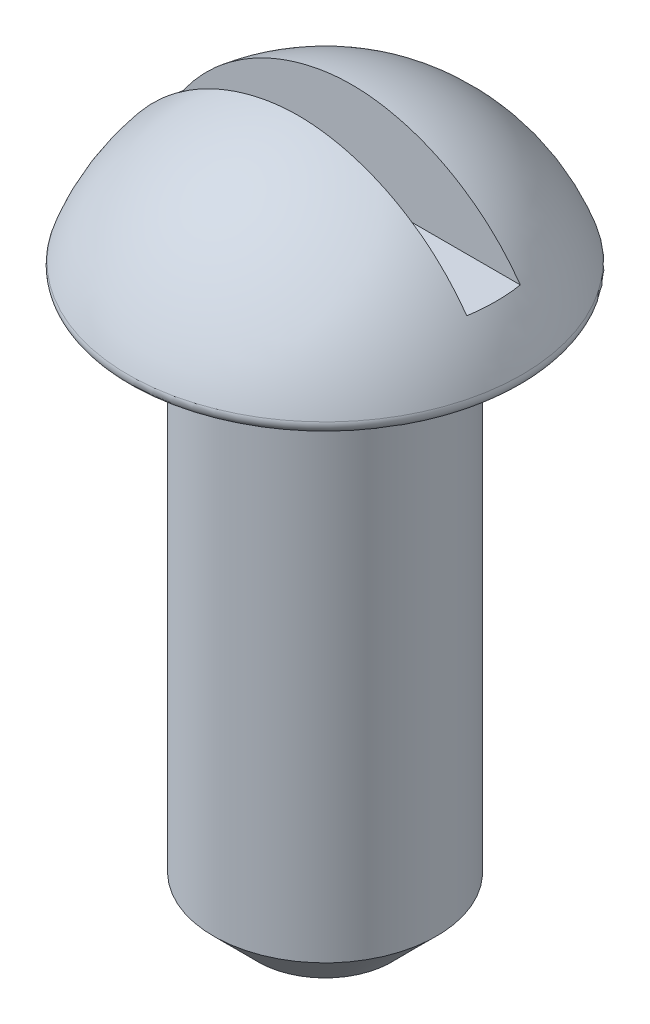
ISO-10303-21;
HEADER;
FILE_DESCRIPTION(('STEP AP214'),'2;1');
FILE_NAME('part.step','',(''),(''),'','','');
FILE_SCHEMA(('AUTOMOTIVE_DESIGN { 1 0 10303 214 1 1 1 1 }'));
ENDSEC;
DATA;
#1=APPLICATION_CONTEXT('core data for automotive mechanical design processes');
#2=APPLICATION_PROTOCOL_DEFINITION('international standard','automotive_design',2000,#1);
#3=PRODUCT_CONTEXT('',#1,'mechanical');
#4=PRODUCT('Part','Part','',(#3));
#5=PRODUCT_RELATED_PRODUCT_CATEGORY('part','',(#4));
#6=PRODUCT_DEFINITION_FORMATION('','',#4);
#7=PRODUCT_DEFINITION_CONTEXT('part definition',#1,'design');
#8=PRODUCT_DEFINITION('design','',#6,#7);
#9=PRODUCT_DEFINITION_SHAPE('','',#8);
#10=(LENGTH_UNIT() NAMED_UNIT(*) SI_UNIT(.MILLI.,.METRE.));
#11=(NAMED_UNIT(*) PLANE_ANGLE_UNIT() SI_UNIT($,.RADIAN.));
#12=(NAMED_UNIT(*) SI_UNIT($,.STERADIAN.) SOLID_ANGLE_UNIT());
#13=UNCERTAINTY_MEASURE_WITH_UNIT(LENGTH_MEASURE(1.E-05),#10,'distance_accuracy_value','');
#14=(GEOMETRIC_REPRESENTATION_CONTEXT(3) GLOBAL_UNCERTAINTY_ASSIGNED_CONTEXT((#13)) GLOBAL_UNIT_ASSIGNED_CONTEXT((#10,
#11,#12)) REPRESENTATION_CONTEXT('',''));
#15=CARTESIAN_POINT('',(0.,0.,0.));
#16=DIRECTION('',(0.,0.,1.));
#17=DIRECTION('',(1.,0.,0.));
#18=AXIS2_PLACEMENT_3D('',#15,#16,#17);
#19=CARTESIAN_POINT('',(0.,89.8612136985376,0.));
#20=DIRECTION('',(0.,1.,0.));
#21=DIRECTION('',(-1.,0.,0.));
#22=AXIS2_PLACEMENT_3D('',#19,#20,#21);
#23=DEGENERATE_TOROIDAL_SURFACE('',#22,0.0534658929339495,2.40000000000001,.F.);
#24=CARTESIAN_POINT('',(0.,90.6686869412309,0.));
#25=DIRECTION('',(0.,-1.,0.));
#26=DIRECTION('',(1.,0.,0.));
#27=AXIS2_PLACEMENT_3D('',#24,#25,#26);
#28=CIRCLE('',#27,2.2066197165805);
#29=CARTESIAN_POINT('',(2.20661971658049,90.6686869412309,0.));
#30=VERTEX_POINT('',#29);
#31=EDGE_CURVE('E109',#30,#30,#28,.F.);
#32=ORIENTED_EDGE('',*,*,#31,.T.);
#33=EDGE_LOOP('',(#32));
#34=FACE_BOUND('',#33,.T.);
#35=CARTESIAN_POINT('',(0.,91.2350422227854,0.));
#36=DIRECTION('',(0.,1.,0.));
#37=DIRECTION('',(0.,0.,1.));
#38=AXIS2_PLACEMENT_3D('',#35,#36,#37);
#39=CIRCLE('',#38,1.91442515739459);
#40=CARTESIAN_POINT('',(1.89077330298089,91.2350422227854,0.3));
#41=VERTEX_POINT('',#40);
#42=CARTESIAN_POINT('',(1.89077330298089,91.2350422227854,-0.3));
#43=VERTEX_POINT('',#42);
#44=EDGE_CURVE('E59',#41,#43,#39,.T.);
#45=ORIENTED_EDGE('',*,*,#44,.F.);
#46=CARTESIAN_POINT('',(0.,92.2350422227854,0.3));
#47=CARTESIAN_POINT('',(-0.100848371690478,92.2350321878107,0.3));
#48=CARTESIAN_POINT('',(-0.201787447572002,92.2273576353458,0.3));
#49=CARTESIAN_POINT('',(-0.366459678367074,92.2035970820281,0.3));
#50=CARTESIAN_POINT('',(-0.430818892932461,92.191407955457,0.3));
#51=CARTESIAN_POINT('',(-0.558288837781709,92.1616587540551,0.3));
#52=CARTESIAN_POINT('',(-0.621399518165776,92.1440984650165,0.3));
#53=CARTESIAN_POINT('',(-0.808395820047688,92.0835444087679,0.3));
#54=CARTESIAN_POINT('',(-0.929831459988878,92.0326943870407,0.3));
#55=CARTESIAN_POINT('',(-1.16286074404738,91.9115362427297,0.3));
#56=CARTESIAN_POINT('',(-1.2744302254421,91.8411820040172,0.3));
#57=CARTESIAN_POINT('',(-1.48438047813139,91.6830512231431,0.3));
#58=CARTESIAN_POINT('',(-1.58276790203237,91.5952835249616,0.3));
#59=CARTESIAN_POINT('',(-1.76524540556903,91.4031097155245,0.3));
#60=CARTESIAN_POINT('',(-1.84906628044512,91.2984478865949,0.3));
#61=CARTESIAN_POINT('',(-1.9979883999925,91.0765338786182,0.3));
#62=CARTESIAN_POINT('',(-2.06308615799744,90.9592793601049,0.3));
#63=CARTESIAN_POINT('',(-2.17276843305649,90.7153682203999,0.3));
#64=CARTESIAN_POINT('',(-2.2173281122971,90.5887004289744,0.3));
#65=CARTESIAN_POINT('',(-2.28455380115353,90.3296880701066,0.3));
#66=CARTESIAN_POINT('',(-2.30722064208471,90.1973437184142,0.3));
#67=CARTESIAN_POINT('',(-2.3300246951293,89.9306900416885,0.3));
#68=CARTESIAN_POINT('',(-2.3301555232407,89.7963801706387,0.3));
#69=CARTESIAN_POINT('',(-2.3078677425782,89.5296433557768,0.3));
#70=CARTESIAN_POINT('',(-2.28544891099428,89.3972164305828,0.3));
#71=CARTESIAN_POINT('',(-2.21869562967325,89.1380016243118,0.3));
#72=CARTESIAN_POINT('',(-2.17436049131951,89.0112139205572,0.3));
#73=CARTESIAN_POINT('',(-2.06503231586471,88.7668814215965,0.3));
#74=CARTESIAN_POINT('',(-2.00003904915328,88.6493367291425,0.3));
#75=CARTESIAN_POINT('',(-1.85123525857421,88.4268350228379,0.3));
#76=CARTESIAN_POINT('',(-1.76742577756094,88.3218773118712,0.3));
#77=CARTESIAN_POINT('',(-1.5833965896332,88.1275486341886,0.3));
#78=CARTESIAN_POINT('',(-1.48317880476966,88.038175844401,0.3));
#79=CARTESIAN_POINT('',(-1.269158249537,87.8775787766974,0.3));
#80=CARTESIAN_POINT('',(-1.15536571875353,87.8063409449171,0.3));
#81=CARTESIAN_POINT('',(-0.977002657044613,87.7146278224101,0.3));
#82=CARTESIAN_POINT('',(-0.916218809754055,87.6865647432198,0.3));
#83=CARTESIAN_POINT('',(-0.792472065458213,87.6356763106977,0.3));
#84=CARTESIAN_POINT('',(-0.72950901360219,87.6128513304597,0.3));
#85=CARTESIAN_POINT('',(-0.601937479136454,87.5726728476787,0.3));
#86=CARTESIAN_POINT('',(-0.537330829104396,87.5553135171512,0.3));
#87=CARTESIAN_POINT('',(-0.406860992449473,87.5262284679164,0.3));
#88=CARTESIAN_POINT('',(-0.340997816473399,87.5145027014968,0.3));
#89=CARTESIAN_POINT('',(-0.208558661916344,87.4970282791506,0.3));
#90=CARTESIAN_POINT('',(-0.141983907705257,87.4912706384504,0.3));
#91=CARTESIAN_POINT('',(-0.041961445965514,87.4875490231141,0.3));
#92=CARTESIAN_POINT('',(-0.00859382098820436,87.4871276306527,0.3));
#93=CARTESIAN_POINT('',(0.0581210045866453,87.4879470211567,0.3));
#94=CARTESIAN_POINT('',(0.0914682051569627,87.4891878063327,0.3));
#95=CARTESIAN_POINT('',(0.186091197136806,87.4949858136209,0.3));
#96=CARTESIAN_POINT('',(0.247256979176967,87.5014551037281,0.3));
#97=CARTESIAN_POINT('',(0.368853441314723,87.5193713042799,0.3));
#98=CARTESIAN_POINT('',(0.429283924629704,87.5308195183342,0.3));
#99=CARTESIAN_POINT('',(0.549138291638741,87.5584884648092,0.3));
#100=CARTESIAN_POINT('',(0.608560603371025,87.5747160344736,0.3));
#101=CARTESIAN_POINT('',(0.725927181812833,87.6117671583596,0.3));
#102=CARTESIAN_POINT('',(0.783871658060108,87.6325900569367,0.3));
#103=CARTESIAN_POINT('',(0.959863617336263,87.7037208768452,0.3));
#104=CARTESIAN_POINT('',(1.0749863041386,87.7615252508314,0.3));
#105=CARTESIAN_POINT('',(1.29425126544972,87.8948734015023,0.3));
#106=CARTESIAN_POINT('',(1.39840105204625,87.9704049262644,0.3));
#107=CARTESIAN_POINT('',(1.59712916487466,88.1406473208625,0.3));
#108=CARTESIAN_POINT('',(1.69115203854631,88.2360088664802,0.3));
#109=CARTESIAN_POINT('',(1.86192648735281,88.4411654553935,0.3));
#110=CARTESIAN_POINT('',(1.93867103105441,88.5509663461046,0.3));
#111=CARTESIAN_POINT('',(2.07283272731725,88.7821210680642,0.3));
#112=CARTESIAN_POINT('',(2.1302080275479,88.9034991988361,0.3));
#113=CARTESIAN_POINT('',(2.2237691589597,89.1541485495781,0.3));
#114=CARTESIAN_POINT('',(2.25995724895863,89.2834189265142,0.3));
#115=CARTESIAN_POINT('',(2.31014138373252,89.5462603949189,0.3));
#116=CARTESIAN_POINT('',(2.32412712673563,89.6798334534993,0.3));
#117=CARTESIAN_POINT('',(2.32947745007233,89.9474337727752,0.3));
#118=CARTESIAN_POINT('',(2.32084168562224,90.0814610403624,0.3));
#119=CARTESIAN_POINT('',(2.28119215869912,90.3461706289947,0.3));
#120=CARTESIAN_POINT('',(2.2501772644219,90.4768527805174,0.3));
#121=CARTESIAN_POINT('',(2.1666449134228,90.7311634815896,0.3));
#122=CARTESIAN_POINT('',(2.11412604949465,90.8547915689222,0.3));
#123=CARTESIAN_POINT('',(1.98907046576465,91.0914810324233,0.3));
#124=CARTESIAN_POINT('',(1.91653253186928,91.2045417671582,0.3));
#125=CARTESIAN_POINT('',(1.75352322640109,91.4168415102063,0.3));
#126=CARTESIAN_POINT('',(1.66305724562227,91.5160846581015,0.3));
#127=CARTESIAN_POINT('',(1.4668047815236,91.6979007564883,0.3));
#128=CARTESIAN_POINT('',(1.36102937097234,91.7804856528429,0.3));
#129=CARTESIAN_POINT('',(1.1369978233755,91.926787348426,0.3));
#130=CARTESIAN_POINT('',(1.0187276147854,91.9904825603059,0.3));
#131=CARTESIAN_POINT('',(0.773055411948245,92.0970299827131,0.3));
#132=CARTESIAN_POINT('',(0.645653742642193,92.1398829344854,0.3));
#133=CARTESIAN_POINT('',(0.450793572249422,92.1872833677843,0.3));
#134=CARTESIAN_POINT('',(0.3852801562954,92.2002658474191,0.3));
#135=CARTESIAN_POINT('',(0.253372674964092,92.2203827524599,0.3));
#136=CARTESIAN_POINT('',(0.186979361428496,92.2275218798816,0.3));
#137=CARTESIAN_POINT('',(0.0803237562217226,92.2338342250275,0.3));
#138=CARTESIAN_POINT('',(0.0401690733163809,92.2350462198318,0.3));
#139=CARTESIAN_POINT('',(0.,92.2350422227854,0.3));
#140=B_SPLINE_CURVE_WITH_KNOTS('',3,(#46,#47,#48,#49,#50,#51,#52,#53,#54,#55,#56,#57,#58,#59,
#60,#61,#62,#63,#64,#65,#66,#67,#68,#69,#70,#71,#72,#73,#74,#75,#76,#77,#78,#79,#80,#81,#82,#83,
#84,#85,#86,#87,#88,#89,#90,#91,#92,#93,#94,#95,#96,#97,#98,#99,#100,#101,#102,#103,#104,#105,
#106,#107,#108,#109,#110,#111,#112,#113,#114,#115,#116,#117,#118,#119,#120,#121,#122,#123,#124,
#125,#126,#127,#128,#129,#130,#131,#132,#133,#134,#135,#136,#137,#138,#139),.UNSPECIFIED.,.T.,
.F.,(4,2,2,2,2,2,2,2,2,2,2,2,2,2,2,2,2,2,2,2,2,2,2,2,2,2,2,2,2,2,2,2,2,2,2,2,2,2,2,2,2,2,2,2,2,
2,4),(0.,0.302452667134651,0.498767609042046,0.695090381223869,1.08807804874249,
1.48200294694679,1.8757282876338,2.27609594927553,2.67653812019709,3.0774633050529,
3.47837326536961,3.87939679527856,4.28042428768362,4.68146438128814,5.08250893251738,
5.48353126206834,5.8845066498626,6.28518146743669,6.48583235677549,6.68649753343195,
6.8869480118366,7.08739679253884,7.28754336543045,7.38761714650624,7.48769106067651,
7.67197015897022,7.85629753532254,8.04088989803356,8.22545594079593,8.61005903655504,
8.99439709689559,9.39423625987201,9.79423784484911,10.1950982873469,10.5959159853943,
10.9969196064379,11.3979293393777,11.7989593544424,12.2000156168546,12.6010962074124,
13.0020563793227,13.4027279868299,13.8038557374099,14.2049692210282,14.4051327517884,
14.6051350566104,14.7256054534767),.UNSPECIFIED.);
#141=CARTESIAN_POINT('',(-1.89077330298091,91.2350422227854,0.3));
#142=VERTEX_POINT('',#141);
#143=EDGE_CURVE('E57',#41,#142,#140,.T.);
#144=ORIENTED_EDGE('',*,*,#143,.T.);
#145=CARTESIAN_POINT('',(-1.89077330298091,91.2350422227854,-0.3));
#146=VERTEX_POINT('',#145);
#147=EDGE_CURVE('E58',#146,#142,#39,.T.);
#148=ORIENTED_EDGE('',*,*,#147,.F.);
#149=CARTESIAN_POINT('',(0.,92.2350422227854,-0.3));
#150=CARTESIAN_POINT('',(0.100848371690464,92.2350321878107,-0.3));
#151=CARTESIAN_POINT('',(0.201787447571988,92.2273576353458,-0.3));
#152=CARTESIAN_POINT('',(0.366459678367059,92.2035970820281,-0.3));
#153=CARTESIAN_POINT('',(0.430818892932444,92.191407955457,-0.3));
#154=CARTESIAN_POINT('',(0.558288837781693,92.1616587540551,-0.3));
#155=CARTESIAN_POINT('',(0.621399518165761,92.1440984650165,-0.3));
#156=CARTESIAN_POINT('',(0.808395820047674,92.0835444087679,-0.3));
#157=CARTESIAN_POINT('',(0.929831459988864,92.0326943870407,-0.3));
#158=CARTESIAN_POINT('',(1.16286074404737,91.9115362427297,-0.3));
#159=CARTESIAN_POINT('',(1.27443022544209,91.8411820040172,-0.3));
#160=CARTESIAN_POINT('',(1.48438047813137,91.6830512231431,-0.3));
#161=CARTESIAN_POINT('',(1.58276790203236,91.5952835249616,-0.3));
#162=CARTESIAN_POINT('',(1.76524540556902,91.4031097155245,-0.3));
#163=CARTESIAN_POINT('',(1.84906628044511,91.2984478865949,-0.3));
#164=CARTESIAN_POINT('',(1.99798839999249,91.0765338786182,-0.3));
#165=CARTESIAN_POINT('',(2.06308615799742,90.9592793601049,-0.3));
#166=CARTESIAN_POINT('',(2.17276843305647,90.7153682203999,-0.3));
#167=CARTESIAN_POINT('',(2.21732811229709,90.5887004289744,-0.3));
#168=CARTESIAN_POINT('',(2.28455380115352,90.3296880701067,-0.3));
#169=CARTESIAN_POINT('',(2.3072206420847,90.1973437184142,-0.3));
#170=CARTESIAN_POINT('',(2.33002469512929,89.9306900416885,-0.3));
#171=CARTESIAN_POINT('',(2.33015552324069,89.7963801706387,-0.3));
#172=CARTESIAN_POINT('',(2.30786774257819,89.5296433557768,-0.3));
#173=CARTESIAN_POINT('',(2.28544891099427,89.3972164305828,-0.3));
#174=CARTESIAN_POINT('',(2.21869562967324,89.1380016243118,-0.3));
#175=CARTESIAN_POINT('',(2.1743604913195,89.0112139205572,-0.3));
#176=CARTESIAN_POINT('',(2.0650323158647,88.7668814215965,-0.3));
#177=CARTESIAN_POINT('',(2.00003904915327,88.6493367291425,-0.3));
#178=CARTESIAN_POINT('',(1.8512352585742,88.4268350228379,-0.3));
#179=CARTESIAN_POINT('',(1.76742577756093,88.3218773118712,-0.3));
#180=CARTESIAN_POINT('',(1.58339658963319,88.1275486341886,-0.3));
#181=CARTESIAN_POINT('',(1.48317880476966,88.038175844401,-0.3));
#182=CARTESIAN_POINT('',(1.269158249537,87.8775787766974,-0.3));
#183=CARTESIAN_POINT('',(1.15536571875353,87.8063409449171,-0.3));
#184=CARTESIAN_POINT('',(0.977002657044607,87.7146278224101,-0.3));
#185=CARTESIAN_POINT('',(0.916218809754048,87.6865647432198,-0.3));
#186=CARTESIAN_POINT('',(0.792472065458204,87.6356763106977,-0.3));
#187=CARTESIAN_POINT('',(0.729509013602181,87.6128513304597,-0.3));
#188=CARTESIAN_POINT('',(0.601937479136444,87.5726728476787,-0.3));
#189=CARTESIAN_POINT('',(0.537330829104385,87.5553135171512,-0.3));
#190=CARTESIAN_POINT('',(0.406860992449463,87.5262284679165,-0.3));
#191=CARTESIAN_POINT('',(0.340997816473388,87.5145027014968,-0.3));
#192=CARTESIAN_POINT('',(0.208558661916332,87.4970282791506,-0.3));
#193=CARTESIAN_POINT('',(0.141983907705244,87.4912706384504,-0.3));
#194=CARTESIAN_POINT('',(0.0419614459655008,87.4875490231141,-0.3));
#195=CARTESIAN_POINT('',(0.00859382098819143,87.4871276306527,-0.3));
#196=CARTESIAN_POINT('',(-0.0581210045866578,87.4879470211567,-0.3));
#197=CARTESIAN_POINT('',(-0.0914682051569749,87.4891878063327,-0.3));
#198=CARTESIAN_POINT('',(-0.186091197136818,87.4949858136209,-0.3));
#199=CARTESIAN_POINT('',(-0.24725697917698,87.5014551037281,-0.3));
#200=CARTESIAN_POINT('',(-0.368853441314735,87.5193713042799,-0.3));
#201=CARTESIAN_POINT('',(-0.429283924629716,87.5308195183342,-0.3));
#202=CARTESIAN_POINT('',(-0.549138291638752,87.5584884648092,-0.3));
#203=CARTESIAN_POINT('',(-0.608560603371035,87.5747160344736,-0.3));
#204=CARTESIAN_POINT('',(-0.725927181812843,87.6117671583596,-0.3));
#205=CARTESIAN_POINT('',(-0.783871658060119,87.6325900569367,-0.3));
#206=CARTESIAN_POINT('',(-0.959863617336276,87.7037208768452,-0.3));
#207=CARTESIAN_POINT('',(-1.07498630413861,87.7615252508314,-0.3));
#208=CARTESIAN_POINT('',(-1.29425126544973,87.8948734015023,-0.3));
#209=CARTESIAN_POINT('',(-1.39840105204626,87.9704049262644,-0.3));
#210=CARTESIAN_POINT('',(-1.59712916487467,88.1406473208625,-0.3));
#211=CARTESIAN_POINT('',(-1.69115203854633,88.2360088664802,-0.3));
#212=CARTESIAN_POINT('',(-1.86192648735282,88.4411654553935,-0.3));
#213=CARTESIAN_POINT('',(-1.93867103105443,88.5509663461046,-0.3));
#214=CARTESIAN_POINT('',(-2.07283272731727,88.7821210680642,-0.3));
#215=CARTESIAN_POINT('',(-2.13020802754792,88.9034991988361,-0.3));
#216=CARTESIAN_POINT('',(-2.22376915895971,89.1541485495781,-0.3));
#217=CARTESIAN_POINT('',(-2.25995724895864,89.2834189265142,-0.3));
#218=CARTESIAN_POINT('',(-2.31014138373253,89.5462603949189,-0.3));
#219=CARTESIAN_POINT('',(-2.32412712673564,89.6798334534993,-0.3));
#220=CARTESIAN_POINT('',(-2.32947745007235,89.9474337727752,-0.3));
#221=CARTESIAN_POINT('',(-2.32084168562226,90.0814610403624,-0.3));
#222=CARTESIAN_POINT('',(-2.28119215869913,90.3461706289947,-0.3));
#223=CARTESIAN_POINT('',(-2.25017726442192,90.4768527805174,-0.3));
#224=CARTESIAN_POINT('',(-2.16664491342281,90.7311634815896,-0.3));
#225=CARTESIAN_POINT('',(-2.11412604949466,90.8547915689222,-0.3));
#226=CARTESIAN_POINT('',(-1.98907046576466,91.0914810324233,-0.3));
#227=CARTESIAN_POINT('',(-1.9165325318693,91.2045417671582,-0.3));
#228=CARTESIAN_POINT('',(-1.75352322640111,91.4168415102063,-0.3));
#229=CARTESIAN_POINT('',(-1.66305724562229,91.5160846581015,-0.3));
#230=CARTESIAN_POINT('',(-1.46680478152361,91.6979007564883,-0.3));
#231=CARTESIAN_POINT('',(-1.36102937097236,91.7804856528429,-0.3));
#232=CARTESIAN_POINT('',(-1.13699782337551,91.926787348426,-0.3));
#233=CARTESIAN_POINT('',(-1.01872761478541,91.9904825603059,-0.3));
#234=CARTESIAN_POINT('',(-0.773055411948259,92.0970299827131,-0.3));
#235=CARTESIAN_POINT('',(-0.645653742642207,92.1398829344854,-0.3));
#236=CARTESIAN_POINT('',(-0.450793572249437,92.1872833677843,-0.3));
#237=CARTESIAN_POINT('',(-0.385280156295417,92.2002658474191,-0.3));
#238=CARTESIAN_POINT('',(-0.253372674964109,92.2203827524599,-0.3));
#239=CARTESIAN_POINT('',(-0.186979361428512,92.2275218798816,-0.3));
#240=CARTESIAN_POINT('',(-0.0803237562217377,92.2338342250275,-0.3));
#241=CARTESIAN_POINT('',(-0.0401690733163955,92.2350462198318,-0.3));
#242=CARTESIAN_POINT('',(0.,92.2350422227854,-0.3));
#243=B_SPLINE_CURVE_WITH_KNOTS('',3,(#149,#150,#151,#152,#153,#154,#155,#156,#157,#158,#159,
#160,#161,#162,#163,#164,#165,#166,#167,#168,#169,#170,#171,#172,#173,#174,#175,#176,#177,#178,
#179,#180,#181,#182,#183,#184,#185,#186,#187,#188,#189,#190,#191,#192,#193,#194,#195,#196,#197,
#198,#199,#200,#201,#202,#203,#204,#205,#206,#207,#208,#209,#210,#211,#212,#213,#214,#215,#216,
#217,#218,#219,#220,#221,#222,#223,#224,#225,#226,#227,#228,#229,#230,#231,#232,#233,#234,#235,
#236,#237,#238,#239,#240,#241,#242),.UNSPECIFIED.,.T.,.F.,(4,2,2,2,2,2,2,2,2,2,2,2,2,2,2,2,2,2,
2,2,2,2,2,2,2,2,2,2,2,2,2,2,2,2,2,2,2,2,2,2,2,2,2,2,2,2,4),(0.,0.302452667134651,
0.498767609042043,0.695090381223869,1.08807804874249,1.48200294694679,1.8757282876338,
2.27609594927553,2.67653812019709,3.07746330505289,3.47837326536961,3.87939679527854,
4.28042428768361,4.68146438128814,5.08250893251738,5.48353126206834,5.88450664986258,
6.28518146743669,6.48583235677548,6.68649753343195,6.88694801183659,7.08739679253884,
7.28754336543045,7.38761714650625,7.48769106067651,7.67197015897022,7.85629753532254,
8.04088989803356,8.22545594079593,8.61005903655504,8.99439709689559,9.39423625987201,
9.79423784484911,10.1950982873469,10.5959159853943,10.9969196064379,11.3979293393777,
11.7989593544424,12.2000156168546,12.6010962074124,13.0020563793227,13.4027279868299,
13.8038557374099,14.2049692210282,14.4051327517884,14.6051350566104,14.7256054534767),.UNSPECIFIED.);
#244=EDGE_CURVE('E51',#146,#43,#243,.T.);
#245=ORIENTED_EDGE('',*,*,#244,.T.);
#246=EDGE_LOOP('',(#45,#144,#148,#245));
#247=FACE_BOUND('',#246,.T.);
#248=ADVANCED_FACE('F29',(#34,#247),#23,.F.);
#249=CARTESIAN_POINT('',(1.25000000000002,90.5350422227853,0.));
#250=DIRECTION('',(0.,1.,0.));
#251=DIRECTION('',(-1.,0.,0.));
#252=AXIS2_PLACEMENT_3D('',#249,#250,#251);
#253=PLANE('',#252);
#254=CARTESIAN_POINT('',(0.,90.5350422227853,0.));
#255=DIRECTION('',(0.,1.,0.));
#256=DIRECTION('',(-1.,0.,0.));
#257=AXIS2_PLACEMENT_3D('',#254,#255,#256);
#258=CIRCLE('',#257,2.11244948285073);
#259=CARTESIAN_POINT('',(-2.11244948285074,90.5350422227853,0.));
#260=VERTEX_POINT('',#259);
#261=EDGE_CURVE('E104',#260,#260,#258,.F.);
#262=ORIENTED_EDGE('',*,*,#261,.T.);
#263=EDGE_LOOP('',(#262));
#264=FACE_BOUND('',#263,.T.);
#265=CARTESIAN_POINT('',(0.,90.5350422227853,0.));
#266=DIRECTION('',(0.,1.,0.));
#267=DIRECTION('',(-1.,0.,0.));
#268=AXIS2_PLACEMENT_3D('',#265,#266,#267);
#269=CIRCLE('',#268,1.25000000000002);
#270=CARTESIAN_POINT('',(-1.25000000000003,90.5350422227853,0.));
#271=VERTEX_POINT('',#270);
#272=EDGE_CURVE('E66',#271,#271,#269,.T.);
#273=ORIENTED_EDGE('',*,*,#272,.T.);
#274=EDGE_LOOP('',(#273));
#275=FACE_BOUND('',#274,.T.);
#276=ADVANCED_FACE('F92',(#264,#275),#253,.F.);
#277=CARTESIAN_POINT('',(0.,125.763182897862,0.));
#278=DIRECTION('',(0.,1.,0.));
#279=DIRECTION('',(-1.,0.,0.));
#280=AXIS2_PLACEMENT_3D('',#277,#278,#279);
#281=CYLINDRICAL_SURFACE('',#280,1.25000000000002);
#282=CARTESIAN_POINT('',(0.,84.7356460627854,0.));
#283=DIRECTION('',(0.,1.,0.));
#284=DIRECTION('',(-1.,0.,0.));
#285=AXIS2_PLACEMENT_3D('',#282,#283,#284);
#286=CIRCLE('',#285,1.25000000000002);
#287=CARTESIAN_POINT('',(-1.25000000000003,84.7356460627854,0.));
#288=VERTEX_POINT('',#287);
#289=EDGE_CURVE('E37',#288,#288,#286,.T.);
#290=ORIENTED_EDGE('',*,*,#289,.T.);
#291=EDGE_LOOP('',(#290));
#292=FACE_BOUND('',#291,.T.);
#293=ORIENTED_EDGE('',*,*,#272,.F.);
#294=EDGE_LOOP('',(#293));
#295=FACE_BOUND('',#294,.T.);
#296=ADVANCED_FACE('F89',(#292,#295),#281,.T.);
#297=CARTESIAN_POINT('',(1.25000000000002,84.2356460627854,0.));
#298=DIRECTION('',(0.,1.,0.));
#299=DIRECTION('',(-1.,0.,0.));
#300=AXIS2_PLACEMENT_3D('',#297,#298,#299);
#301=PLANE('',#300);
#302=CARTESIAN_POINT('',(0.,84.2356460627854,0.));
#303=DIRECTION('',(0.,1.,0.));
#304=DIRECTION('',(-1.,0.,0.));
#305=AXIS2_PLACEMENT_3D('',#302,#303,#304);
#306=CIRCLE('',#305,0.75000000000002);
#307=CARTESIAN_POINT('',(-0.750000000000026,84.2356460627854,0.));
#308=VERTEX_POINT('',#307);
#309=EDGE_CURVE('E11',#308,#308,#306,.F.);
#310=ORIENTED_EDGE('',*,*,#309,.T.);
#311=EDGE_LOOP('',(#310));
#312=FACE_BOUND('',#311,.T.);
#313=ADVANCED_FACE('F86',(#312),#301,.F.);
#314=CARTESIAN_POINT('',(-2.25000000000001,91.2350422227854,0.3));
#315=DIRECTION('',(0.,1.,0.));
#316=DIRECTION('',(0.,0.,1.));
#317=AXIS2_PLACEMENT_3D('',#314,#315,#316);
#318=PLANE('',#317);
#319=ORIENTED_EDGE('',*,*,#44,.T.);
#320=DIRECTION('',(-1.,0.,0.));
#321=VECTOR('',#320,1.);
#322=CARTESIAN_POINT('',(-2.25000000000001,91.2350422227854,-0.3));
#323=LINE('',#322,#321);
#324=EDGE_CURVE('E44',#43,#146,#323,.T.);
#325=ORIENTED_EDGE('',*,*,#324,.T.);
#326=ORIENTED_EDGE('',*,*,#147,.T.);
#327=DIRECTION('',(1.,0.,0.));
#328=VECTOR('',#327,1.);
#329=CARTESIAN_POINT('',(-2.25000000000001,91.2350422227854,0.3));
#330=LINE('',#329,#328);
#331=EDGE_CURVE('E65',#142,#41,#330,.T.);
#332=ORIENTED_EDGE('',*,*,#331,.T.);
#333=EDGE_LOOP('',(#319,#325,#326,#332));
#334=FACE_BOUND('',#333,.T.);
#335=ADVANCED_FACE('F64',(#334),#318,.T.);
#336=CARTESIAN_POINT('',(-2.25000000000001,91.2350422227854,-0.3));
#337=DIRECTION('',(0.,0.,-1.));
#338=DIRECTION('',(-1.,0.,0.));
#339=AXIS2_PLACEMENT_3D('',#336,#337,#338);
#340=PLANE('',#339);
#341=ORIENTED_EDGE('',*,*,#244,.F.);
#342=ORIENTED_EDGE('',*,*,#324,.F.);
#343=EDGE_LOOP('',(#341,#342));
#344=FACE_BOUND('',#343,.T.);
#345=ADVANCED_FACE('F83',(#344),#340,.F.);
#346=CARTESIAN_POINT('',(-2.25000000000001,91.2350422227854,0.3));
#347=DIRECTION('',(0.,0.,1.));
#348=DIRECTION('',(1.,0.,0.));
#349=AXIS2_PLACEMENT_3D('',#346,#347,#348);
#350=PLANE('',#349);
#351=ORIENTED_EDGE('',*,*,#143,.F.);
#352=ORIENTED_EDGE('',*,*,#331,.F.);
#353=EDGE_LOOP('',(#351,#352));
#354=FACE_BOUND('',#353,.T.);
#355=ADVANCED_FACE('F68',(#354),#350,.F.);
#356=CARTESIAN_POINT('',(0.,90.6350422227854,0.));
#357=DIRECTION('',(0.,1.,0.));
#358=DIRECTION('',(-1.,0.,0.));
#359=AXIS2_PLACEMENT_3D('',#356,#357,#358);
#360=TOROIDAL_SURFACE('',#359,2.11244948285073,0.1);
#361=ORIENTED_EDGE('',*,*,#261,.F.);
#362=EDGE_LOOP('',(#361));
#363=FACE_BOUND('',#362,.T.);
#364=ORIENTED_EDGE('',*,*,#31,.F.);
#365=EDGE_LOOP('',(#364));
#366=FACE_BOUND('',#365,.T.);
#367=ADVANCED_FACE('F82',(#363,#366),#360,.T.);
#368=CARTESIAN_POINT('',(0.,84.7356460627854,0.));
#369=DIRECTION('',(0.,1.,0.));
#370=DIRECTION('',(-1.,0.,0.));
#371=AXIS2_PLACEMENT_3D('',#368,#369,#370);
#372=CONICAL_SURFACE('',#371,1.25000000000002,0.78539816339745);
#373=ORIENTED_EDGE('',*,*,#309,.F.);
#374=EDGE_LOOP('',(#373));
#375=FACE_BOUND('',#374,.T.);
#376=ORIENTED_EDGE('',*,*,#289,.F.);
#377=EDGE_LOOP('',(#376));
#378=FACE_BOUND('',#377,.T.);
#379=ADVANCED_FACE('F115',(#375,#378),#372,.T.);
#380=CLOSED_SHELL('',(#248,#276,#296,#313,#335,#345,#355,#367,#379));
#381=MANIFOLD_SOLID_BREP('B2',#380);
#382=ADVANCED_BREP_SHAPE_REPRESENTATION('',(#18,#381),#14);
#383=SHAPE_DEFINITION_REPRESENTATION(#9,#382);
ENDSEC;
END-ISO-10303-21;
